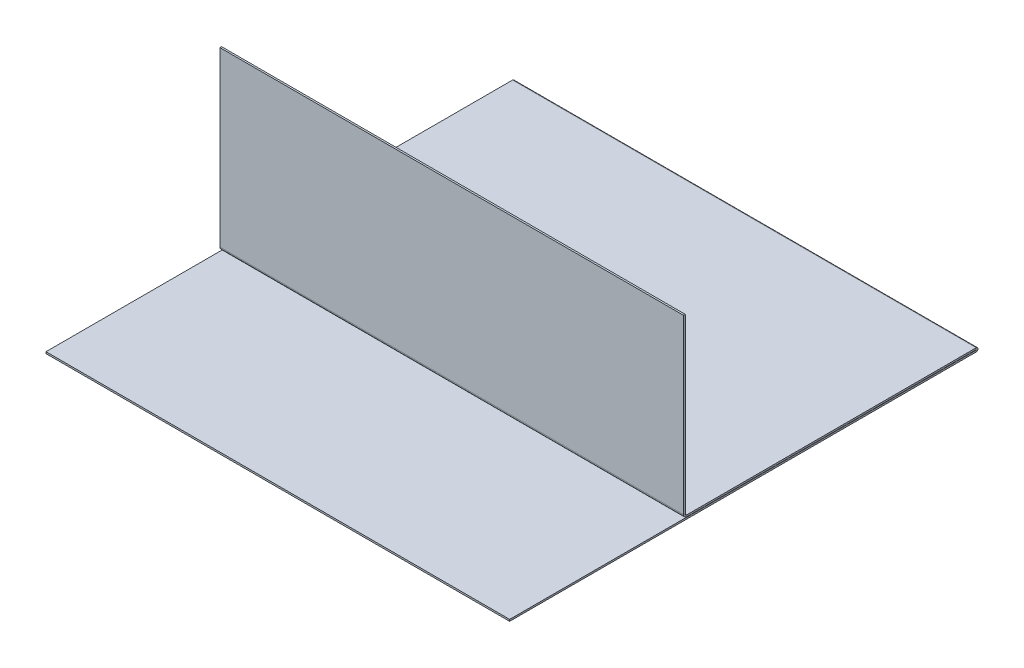
ISO-10303-21;
HEADER;
FILE_DESCRIPTION(('STEP AP214'),'2;1');
FILE_NAME('part.step','',(''),(''),'','','');
FILE_SCHEMA(('AUTOMOTIVE_DESIGN { 1 0 10303 214 1 1 1 1 }'));
ENDSEC;
DATA;
#1=APPLICATION_CONTEXT('core data for automotive mechanical design processes');
#2=APPLICATION_PROTOCOL_DEFINITION('international standard','automotive_design',2000,#1);
#3=PRODUCT_CONTEXT('',#1,'mechanical');
#4=PRODUCT('Part','Part','',(#3));
#5=PRODUCT_RELATED_PRODUCT_CATEGORY('part','',(#4));
#6=PRODUCT_DEFINITION_FORMATION('','',#4);
#7=PRODUCT_DEFINITION_CONTEXT('part definition',#1,'design');
#8=PRODUCT_DEFINITION('design','',#6,#7);
#9=PRODUCT_DEFINITION_SHAPE('','',#8);
#10=(LENGTH_UNIT() NAMED_UNIT(*) SI_UNIT(.MILLI.,.METRE.));
#11=(NAMED_UNIT(*) PLANE_ANGLE_UNIT() SI_UNIT($,.RADIAN.));
#12=(NAMED_UNIT(*) SI_UNIT($,.STERADIAN.) SOLID_ANGLE_UNIT());
#13=UNCERTAINTY_MEASURE_WITH_UNIT(LENGTH_MEASURE(1.E-05),#10,'distance_accuracy_value','');
#14=(GEOMETRIC_REPRESENTATION_CONTEXT(3) GLOBAL_UNCERTAINTY_ASSIGNED_CONTEXT((#13)) GLOBAL_UNIT_ASSIGNED_CONTEXT((#10,
#11,#12)) REPRESENTATION_CONTEXT('',''));
#15=CARTESIAN_POINT('',(0.,0.,0.));
#16=DIRECTION('',(0.,0.,1.));
#17=DIRECTION('',(1.,0.,0.));
#18=AXIS2_PLACEMENT_3D('',#15,#16,#17);
#19=CARTESIAN_POINT('',(99.,-0.7366,-94.9915014164306));
#20=DIRECTION('',(1.,0.,0.));
#21=DIRECTION('',(0.,0.,-1.));
#22=AXIS2_PLACEMENT_3D('',#19,#20,#21);
#23=PLANE('',#22);
#24=DIRECTION('',(0.,0.,-1.));
#25=VECTOR('',#24,1.);
#26=CARTESIAN_POINT('',(99.,-0.7366,-94.9915014164306));
#27=LINE('',#26,#25);
#28=CARTESIAN_POINT('',(99.,-0.736600000000005,29.2718985835694));
#29=VERTEX_POINT('',#28);
#30=CARTESIAN_POINT('',(99.,-0.7366,-94.2049014164306));
#31=VERTEX_POINT('',#30);
#32=EDGE_CURVE('E11',#29,#31,#27,.T.);
#33=ORIENTED_EDGE('',*,*,#32,.T.);
#34=DIRECTION('',(0.,1.,0.));
#35=VECTOR('',#34,1.);
#36=CARTESIAN_POINT('',(99.,-0.7366,-94.2049014164306));
#37=LINE('',#36,#35);
#38=CARTESIAN_POINT('',(99.,0.,-94.2049014164306));
#39=VERTEX_POINT('',#38);
#40=EDGE_CURVE('E140',#31,#39,#37,.T.);
#41=ORIENTED_EDGE('',*,*,#40,.T.);
#42=DIRECTION('',(0.,0.,-1.));
#43=VECTOR('',#42,1.);
#44=CARTESIAN_POINT('',(99.,0.,-94.9915014164306));
#45=LINE('',#44,#43);
#46=CARTESIAN_POINT('',(99.,0.,29.2718985835694));
#47=VERTEX_POINT('',#46);
#48=EDGE_CURVE('E39',#47,#39,#45,.T.);
#49=ORIENTED_EDGE('',*,*,#48,.F.);
#50=DIRECTION('',(0.,-1.,0.));
#51=VECTOR('',#50,1.);
#52=CARTESIAN_POINT('',(99.,0.,29.2718985835694));
#53=LINE('',#52,#51);
#54=EDGE_CURVE('E234',#47,#29,#53,.T.);
#55=ORIENTED_EDGE('',*,*,#54,.T.);
#56=EDGE_LOOP('',(#33,#41,#49,#55));
#57=FACE_BOUND('',#56,.T.);
#58=ADVANCED_FACE('F35',(#57),#23,.T.);
#59=CARTESIAN_POINT('',(0.,-0.7366,0.));
#60=DIRECTION('',(0.,1.,0.));
#61=DIRECTION('',(0.,0.,1.));
#62=AXIS2_PLACEMENT_3D('',#59,#60,#61);
#63=PLANE('',#62);
#64=DIRECTION('',(0.,0.,1.));
#65=VECTOR('',#64,1.);
#66=CARTESIAN_POINT('',(-99.,-0.7366,-94.9915014164306));
#67=LINE('',#66,#65);
#68=CARTESIAN_POINT('',(-99.,-0.7366,-94.2049014164306));
#69=VERTEX_POINT('',#68);
#70=CARTESIAN_POINT('',(-99.,-0.7366,29.2718985835694));
#71=VERTEX_POINT('',#70);
#72=EDGE_CURVE('E44',#69,#71,#67,.T.);
#73=ORIENTED_EDGE('',*,*,#72,.F.);
#74=DIRECTION('',(1.,0.,0.));
#75=VECTOR('',#74,1.);
#76=CARTESIAN_POINT('',(99.,-0.7366,-94.2049014164306));
#77=LINE('',#76,#75);
#78=EDGE_CURVE('E161',#31,#69,#77,.F.);
#79=ORIENTED_EDGE('',*,*,#78,.F.);
#80=ORIENTED_EDGE('',*,*,#32,.F.);
#81=DIRECTION('',(1.,0.,0.));
#82=VECTOR('',#81,1.);
#83=CARTESIAN_POINT('',(99.,-0.736600000000005,29.2718985835694));
#84=LINE('',#83,#82);
#85=EDGE_CURVE('E227',#29,#71,#84,.F.);
#86=ORIENTED_EDGE('',*,*,#85,.T.);
#87=EDGE_LOOP('',(#73,#79,#80,#86));
#88=FACE_BOUND('',#87,.T.);
#89=ADVANCED_FACE('F249',(#88),#63,.F.);
#90=CARTESIAN_POINT('',(0.,0.,0.));
#91=DIRECTION('',(0.,1.,0.));
#92=DIRECTION('',(0.,0.,1.));
#93=AXIS2_PLACEMENT_3D('',#90,#91,#92);
#94=PLANE('',#93);
#95=DIRECTION('',(1.,0.,0.));
#96=VECTOR('',#95,1.);
#97=CARTESIAN_POINT('',(99.,0.,-94.2049014164306));
#98=LINE('',#97,#96);
#99=CARTESIAN_POINT('',(-99.,0.,-94.2049014164306));
#100=VERTEX_POINT('',#99);
#101=EDGE_CURVE('E147',#39,#100,#98,.F.);
#102=ORIENTED_EDGE('',*,*,#101,.T.);
#103=DIRECTION('',(0.,0.,1.));
#104=VECTOR('',#103,1.);
#105=CARTESIAN_POINT('',(-99.,0.,-94.9915014164306));
#106=LINE('',#105,#104);
#107=CARTESIAN_POINT('',(-99.,0.,29.2718985835694));
#108=VERTEX_POINT('',#107);
#109=EDGE_CURVE('E152',#100,#108,#106,.T.);
#110=ORIENTED_EDGE('',*,*,#109,.T.);
#111=DIRECTION('',(1.,0.,0.));
#112=VECTOR('',#111,1.);
#113=CARTESIAN_POINT('',(99.,0.,29.2718985835694));
#114=LINE('',#113,#112);
#115=EDGE_CURVE('E60',#47,#108,#114,.F.);
#116=ORIENTED_EDGE('',*,*,#115,.F.);
#117=ORIENTED_EDGE('',*,*,#48,.T.);
#118=EDGE_LOOP('',(#102,#110,#116,#117));
#119=FACE_BOUND('',#118,.T.);
#120=ADVANCED_FACE('F155',(#119),#94,.T.);
#121=CARTESIAN_POINT('',(-99.,-0.7366,-94.9915014164306));
#122=DIRECTION('',(-1.,0.,0.));
#123=DIRECTION('',(0.,0.,1.));
#124=AXIS2_PLACEMENT_3D('',#121,#122,#123);
#125=PLANE('',#124);
#126=DIRECTION('',(0.,1.,0.));
#127=VECTOR('',#126,1.);
#128=CARTESIAN_POINT('',(-99.,-0.7366,-94.2049014164306));
#129=LINE('',#128,#127);
#130=EDGE_CURVE('E129',#69,#100,#129,.T.);
#131=ORIENTED_EDGE('',*,*,#130,.F.);
#132=ORIENTED_EDGE('',*,*,#72,.T.);
#133=DIRECTION('',(0.,-1.,0.));
#134=VECTOR('',#133,1.);
#135=CARTESIAN_POINT('',(-99.,0.,29.2718985835694));
#136=LINE('',#135,#134);
#137=EDGE_CURVE('E154',#108,#71,#136,.T.);
#138=ORIENTED_EDGE('',*,*,#137,.F.);
#139=ORIENTED_EDGE('',*,*,#109,.F.);
#140=EDGE_LOOP('',(#131,#132,#138,#139));
#141=FACE_BOUND('',#140,.T.);
#142=ADVANCED_FACE('F37',(#141),#125,.T.);
#143=CARTESIAN_POINT('',(-99.,0.736599999999995,29.2718985835694));
#144=DIRECTION('',(-1.,0.,0.));
#145=DIRECTION('',(0.,0.,1.));
#146=AXIS2_PLACEMENT_3D('',#143,#144,#145);
#147=PLANE('',#146);
#148=DIRECTION('',(0.,0.,1.));
#149=VECTOR('',#148,1.);
#150=CARTESIAN_POINT('',(-99.,0.736599999999997,30.0084985835694));
#151=LINE('',#150,#149);
#152=CARTESIAN_POINT('',(-99.,0.736599999999995,30.0084985835694));
#153=VERTEX_POINT('',#152);
#154=CARTESIAN_POINT('',(-99.,0.736599999999995,30.7450985835694));
#155=VERTEX_POINT('',#154);
#156=EDGE_CURVE('E195',#153,#155,#151,.T.);
#157=ORIENTED_EDGE('',*,*,#156,.F.);
#158=CARTESIAN_POINT('',(-99.,0.736599999999995,29.2718985835694));
#159=DIRECTION('',(1.,0.,0.));
#160=DIRECTION('',(0.,0.,-1.));
#161=AXIS2_PLACEMENT_3D('',#158,#159,#160);
#162=CIRCLE('',#161,0.7366);
#163=EDGE_CURVE('E237',#108,#153,#162,.F.);
#164=ORIENTED_EDGE('',*,*,#163,.F.);
#165=ORIENTED_EDGE('',*,*,#137,.T.);
#166=CARTESIAN_POINT('',(-99.,0.736599999999995,29.2718985835694));
#167=DIRECTION('',(1.,0.,0.));
#168=DIRECTION('',(0.,0.,-1.));
#169=AXIS2_PLACEMENT_3D('',#166,#167,#168);
#170=CIRCLE('',#169,1.4732);
#171=EDGE_CURVE('E230',#71,#155,#170,.F.);
#172=ORIENTED_EDGE('',*,*,#171,.T.);
#173=EDGE_LOOP('',(#157,#164,#165,#172));
#174=FACE_BOUND('',#173,.T.);
#175=ADVANCED_FACE('F254',(#174),#147,.T.);
#176=CARTESIAN_POINT('',(99.,0.736599999999995,29.2718985835694));
#177=DIRECTION('',(-1.,0.,0.));
#178=DIRECTION('',(0.,0.,1.));
#179=AXIS2_PLACEMENT_3D('',#176,#177,#178);
#180=PLANE('',#179);
#181=CARTESIAN_POINT('',(99.,0.736599999999995,29.2718985835694));
#182=DIRECTION('',(1.,0.,0.));
#183=DIRECTION('',(0.,0.,-1.));
#184=AXIS2_PLACEMENT_3D('',#181,#182,#183);
#185=CIRCLE('',#184,0.7366);
#186=CARTESIAN_POINT('',(99.,0.736599999999995,30.0084985835694));
#187=VERTEX_POINT('',#186);
#188=EDGE_CURVE('E226',#187,#47,#185,.T.);
#189=ORIENTED_EDGE('',*,*,#188,.F.);
#190=DIRECTION('',(0.,0.,1.));
#191=VECTOR('',#190,1.);
#192=CARTESIAN_POINT('',(99.,0.736599999999993,30.0084985835694));
#193=LINE('',#192,#191);
#194=CARTESIAN_POINT('',(99.,0.736599999999993,30.7450985835694));
#195=VERTEX_POINT('',#194);
#196=EDGE_CURVE('E199',#187,#195,#193,.T.);
#197=ORIENTED_EDGE('',*,*,#196,.T.);
#198=CARTESIAN_POINT('',(99.,0.736599999999995,29.2718985835694));
#199=DIRECTION('',(1.,0.,0.));
#200=DIRECTION('',(0.,0.,-1.));
#201=AXIS2_PLACEMENT_3D('',#198,#199,#200);
#202=CIRCLE('',#201,1.4732);
#203=EDGE_CURVE('E231',#195,#29,#202,.T.);
#204=ORIENTED_EDGE('',*,*,#203,.T.);
#205=ORIENTED_EDGE('',*,*,#54,.F.);
#206=EDGE_LOOP('',(#189,#197,#204,#205));
#207=FACE_BOUND('',#206,.T.);
#208=ADVANCED_FACE('F298',(#207),#180,.F.);
#209=CARTESIAN_POINT('',(99.,0.736599999999995,29.2718985835694));
#210=DIRECTION('',(1.,0.,0.));
#211=DIRECTION('',(0.,0.,1.));
#212=AXIS2_PLACEMENT_3D('',#209,#210,#211);
#213=CYLINDRICAL_SURFACE('',#212,1.4732);
#214=ORIENTED_EDGE('',*,*,#85,.F.);
#215=ORIENTED_EDGE('',*,*,#203,.F.);
#216=DIRECTION('',(-1.,0.,0.));
#217=VECTOR('',#216,1.);
#218=CARTESIAN_POINT('',(0.,0.736599999999995,30.7450985835694));
#219=LINE('',#218,#217);
#220=EDGE_CURVE('E202',#195,#155,#219,.T.);
#221=ORIENTED_EDGE('',*,*,#220,.T.);
#222=ORIENTED_EDGE('',*,*,#171,.F.);
#223=EDGE_LOOP('',(#214,#215,#221,#222));
#224=FACE_BOUND('',#223,.T.);
#225=ADVANCED_FACE('F255',(#224),#213,.T.);
#226=CARTESIAN_POINT('',(99.,0.736599999999995,29.2718985835694));
#227=DIRECTION('',(1.,0.,0.));
#228=DIRECTION('',(0.,0.,1.));
#229=AXIS2_PLACEMENT_3D('',#226,#227,#228);
#230=CYLINDRICAL_SURFACE('',#229,0.7366);
#231=ORIENTED_EDGE('',*,*,#115,.T.);
#232=ORIENTED_EDGE('',*,*,#163,.T.);
#233=DIRECTION('',(1.,0.,0.));
#234=VECTOR('',#233,1.);
#235=CARTESIAN_POINT('',(-99.,0.736599999999997,30.0084985835694));
#236=LINE('',#235,#234);
#237=EDGE_CURVE('E197',#153,#187,#236,.T.);
#238=ORIENTED_EDGE('',*,*,#237,.T.);
#239=ORIENTED_EDGE('',*,*,#188,.T.);
#240=EDGE_LOOP('',(#231,#232,#238,#239));
#241=FACE_BOUND('',#240,.T.);
#242=ADVANCED_FACE('F276',(#241),#230,.F.);
#243=CARTESIAN_POINT('',(-99.,0.,30.7450985835694));
#244=DIRECTION('',(1.,0.,0.));
#245=DIRECTION('',(0.,0.,-1.));
#246=AXIS2_PLACEMENT_3D('',#243,#244,#245);
#247=PLANE('',#246);
#248=ORIENTED_EDGE('',*,*,#156,.T.);
#249=DIRECTION('',(0.,-1.,0.));
#250=VECTOR('',#249,1.);
#251=CARTESIAN_POINT('',(-99.,0.,30.7450985835694));
#252=LINE('',#251,#250);
#253=CARTESIAN_POINT('',(-99.,74.4732,30.7450985835694));
#254=VERTEX_POINT('',#253);
#255=EDGE_CURVE('E207',#254,#155,#252,.T.);
#256=ORIENTED_EDGE('',*,*,#255,.F.);
#257=DIRECTION('',(0.,0.,-1.));
#258=VECTOR('',#257,1.);
#259=CARTESIAN_POINT('',(-99.,74.4732,30.7450985835694));
#260=LINE('',#259,#258);
#261=CARTESIAN_POINT('',(-99.,74.4732,30.0084985835694));
#262=VERTEX_POINT('',#261);
#263=EDGE_CURVE('E215',#254,#262,#260,.T.);
#264=ORIENTED_EDGE('',*,*,#263,.T.);
#265=DIRECTION('',(0.,-1.,0.));
#266=VECTOR('',#265,1.);
#267=CARTESIAN_POINT('',(-99.,0.,30.0084985835694));
#268=LINE('',#267,#266);
#269=EDGE_CURVE('E206',#262,#153,#268,.T.);
#270=ORIENTED_EDGE('',*,*,#269,.T.);
#271=EDGE_LOOP('',(#248,#256,#264,#270));
#272=FACE_BOUND('',#271,.T.);
#273=ADVANCED_FACE('F273',(#272),#247,.F.);
#274=CARTESIAN_POINT('',(99.,74.4732,30.7450985835694));
#275=DIRECTION('',(-1.,0.,0.));
#276=DIRECTION('',(0.,0.,1.));
#277=AXIS2_PLACEMENT_3D('',#274,#275,#276);
#278=PLANE('',#277);
#279=ORIENTED_EDGE('',*,*,#196,.F.);
#280=DIRECTION('',(0.,1.,0.));
#281=VECTOR('',#280,1.);
#282=CARTESIAN_POINT('',(99.,74.4732,30.0084985835694));
#283=LINE('',#282,#281);
#284=CARTESIAN_POINT('',(99.,74.4732,30.0084985835694));
#285=VERTEX_POINT('',#284);
#286=EDGE_CURVE('E218',#187,#285,#283,.T.);
#287=ORIENTED_EDGE('',*,*,#286,.T.);
#288=DIRECTION('',(0.,0.,-1.));
#289=VECTOR('',#288,1.);
#290=CARTESIAN_POINT('',(99.,74.4732,30.7450985835694));
#291=LINE('',#290,#289);
#292=CARTESIAN_POINT('',(99.,74.4732,30.7450985835694));
#293=VERTEX_POINT('',#292);
#294=EDGE_CURVE('E223',#293,#285,#291,.T.);
#295=ORIENTED_EDGE('',*,*,#294,.F.);
#296=DIRECTION('',(0.,1.,0.));
#297=VECTOR('',#296,1.);
#298=CARTESIAN_POINT('',(99.,74.4732,30.7450985835694));
#299=LINE('',#298,#297);
#300=EDGE_CURVE('E210',#195,#293,#299,.T.);
#301=ORIENTED_EDGE('',*,*,#300,.F.);
#302=EDGE_LOOP('',(#279,#287,#295,#301));
#303=FACE_BOUND('',#302,.T.);
#304=ADVANCED_FACE('F264',(#303),#278,.F.);
#305=CARTESIAN_POINT('',(0.,0.,30.7450985835694));
#306=DIRECTION('',(0.,0.,-1.));
#307=DIRECTION('',(-1.,0.,0.));
#308=AXIS2_PLACEMENT_3D('',#305,#306,#307);
#309=PLANE('',#308);
#310=ORIENTED_EDGE('',*,*,#220,.F.);
#311=ORIENTED_EDGE('',*,*,#300,.T.);
#312=DIRECTION('',(-1.,0.,0.));
#313=VECTOR('',#312,1.);
#314=CARTESIAN_POINT('',(-99.,74.4732,30.7450985835694));
#315=LINE('',#314,#313);
#316=EDGE_CURVE('E213',#293,#254,#315,.T.);
#317=ORIENTED_EDGE('',*,*,#316,.T.);
#318=ORIENTED_EDGE('',*,*,#255,.T.);
#319=EDGE_LOOP('',(#310,#311,#317,#318));
#320=FACE_BOUND('',#319,.T.);
#321=ADVANCED_FACE('F259',(#320),#309,.F.);
#322=CARTESIAN_POINT('',(0.,0.,30.0084985835694));
#323=DIRECTION('',(0.,0.,-1.));
#324=DIRECTION('',(-1.,0.,0.));
#325=AXIS2_PLACEMENT_3D('',#322,#323,#324);
#326=PLANE('',#325);
#327=ORIENTED_EDGE('',*,*,#286,.F.);
#328=ORIENTED_EDGE('',*,*,#237,.F.);
#329=ORIENTED_EDGE('',*,*,#269,.F.);
#330=DIRECTION('',(-1.,0.,0.));
#331=VECTOR('',#330,1.);
#332=CARTESIAN_POINT('',(-99.,74.4732,30.0084985835694));
#333=LINE('',#332,#331);
#334=EDGE_CURVE('E211',#285,#262,#333,.T.);
#335=ORIENTED_EDGE('',*,*,#334,.F.);
#336=EDGE_LOOP('',(#327,#328,#329,#335));
#337=FACE_BOUND('',#336,.T.);
#338=ADVANCED_FACE('F279',(#337),#326,.T.);
#339=CARTESIAN_POINT('',(-99.,74.4732,30.7450985835694));
#340=DIRECTION('',(0.,-1.,0.));
#341=DIRECTION('',(0.,0.,-1.));
#342=AXIS2_PLACEMENT_3D('',#339,#340,#341);
#343=PLANE('',#342);
#344=ORIENTED_EDGE('',*,*,#334,.T.);
#345=ORIENTED_EDGE('',*,*,#263,.F.);
#346=ORIENTED_EDGE('',*,*,#316,.F.);
#347=ORIENTED_EDGE('',*,*,#294,.T.);
#348=EDGE_LOOP('',(#344,#345,#346,#347));
#349=FACE_BOUND('',#348,.T.);
#350=ADVANCED_FACE('F270',(#349),#343,.F.);
#351=CARTESIAN_POINT('',(99.,-1.5732,5.40179858356944));
#352=DIRECTION('',(-1.,0.,0.));
#353=DIRECTION('',(0.,0.,-1.));
#354=AXIS2_PLACEMENT_3D('',#351,#352,#353);
#355=PLANE('',#354);
#356=DIRECTION('',(0.,-1.,0.));
#357=VECTOR('',#356,1.);
#358=CARTESIAN_POINT('',(99.,-1.5732,-94.2049014164306));
#359=LINE('',#358,#357);
#360=CARTESIAN_POINT('',(99.,-0.8366,-94.2049014164306));
#361=VERTEX_POINT('',#360);
#362=CARTESIAN_POINT('',(99.,-1.5732,-94.2049014164306));
#363=VERTEX_POINT('',#362);
#364=EDGE_CURVE('E189',#361,#363,#359,.T.);
#365=ORIENTED_EDGE('',*,*,#364,.F.);
#366=DIRECTION('',(0.,0.,-1.));
#367=VECTOR('',#366,1.);
#368=CARTESIAN_POINT('',(99.,-0.8366,5.40179858356944));
#369=LINE('',#368,#367);
#370=CARTESIAN_POINT('',(99.,-0.8366,105.008498583569));
#371=VERTEX_POINT('',#370);
#372=EDGE_CURVE('E180',#371,#361,#369,.T.);
#373=ORIENTED_EDGE('',*,*,#372,.F.);
#374=DIRECTION('',(0.,-1.,0.));
#375=VECTOR('',#374,1.);
#376=CARTESIAN_POINT('',(99.,-1.5732,105.008498583569));
#377=LINE('',#376,#375);
#378=CARTESIAN_POINT('',(99.,-1.5732,105.008498583569));
#379=VERTEX_POINT('',#378);
#380=EDGE_CURVE('E187',#371,#379,#377,.T.);
#381=ORIENTED_EDGE('',*,*,#380,.T.);
#382=DIRECTION('',(0.,0.,-1.));
#383=VECTOR('',#382,1.);
#384=CARTESIAN_POINT('',(99.,-1.5732,5.40179858356944));
#385=LINE('',#384,#383);
#386=EDGE_CURVE('E170',#379,#363,#385,.T.);
#387=ORIENTED_EDGE('',*,*,#386,.T.);
#388=EDGE_LOOP('',(#365,#373,#381,#387));
#389=FACE_BOUND('',#388,.T.);
#390=ADVANCED_FACE('F286',(#389),#355,.F.);
#391=CARTESIAN_POINT('',(0.,-1.5732,105.008498583569));
#392=DIRECTION('',(0.,0.,-1.));
#393=DIRECTION('',(1.,0.,0.));
#394=AXIS2_PLACEMENT_3D('',#391,#392,#393);
#395=PLANE('',#394);
#396=ORIENTED_EDGE('',*,*,#380,.F.);
#397=DIRECTION('',(1.,0.,0.));
#398=VECTOR('',#397,1.);
#399=CARTESIAN_POINT('',(0.,-0.8366,105.008498583569));
#400=LINE('',#399,#398);
#401=CARTESIAN_POINT('',(-99.,-0.8366,105.008498583569));
#402=VERTEX_POINT('',#401);
#403=EDGE_CURVE('E177',#402,#371,#400,.T.);
#404=ORIENTED_EDGE('',*,*,#403,.F.);
#405=DIRECTION('',(0.,-1.,0.));
#406=VECTOR('',#405,1.);
#407=CARTESIAN_POINT('',(-99.,-1.5732,105.008498583569));
#408=LINE('',#407,#406);
#409=CARTESIAN_POINT('',(-99.,-1.5732,105.008498583569));
#410=VERTEX_POINT('',#409);
#411=EDGE_CURVE('E169',#402,#410,#408,.T.);
#412=ORIENTED_EDGE('',*,*,#411,.T.);
#413=DIRECTION('',(1.,0.,0.));
#414=VECTOR('',#413,1.);
#415=CARTESIAN_POINT('',(0.,-1.5732,105.008498583569));
#416=LINE('',#415,#414);
#417=EDGE_CURVE('E166',#410,#379,#416,.T.);
#418=ORIENTED_EDGE('',*,*,#417,.T.);
#419=EDGE_LOOP('',(#396,#404,#412,#418));
#420=FACE_BOUND('',#419,.T.);
#421=ADVANCED_FACE('F367',(#420),#395,.F.);
#422=CARTESIAN_POINT('',(-99.,-1.5732,5.40179858356944));
#423=DIRECTION('',(1.,0.,0.));
#424=DIRECTION('',(0.,0.,1.));
#425=AXIS2_PLACEMENT_3D('',#422,#423,#424);
#426=PLANE('',#425);
#427=DIRECTION('',(0.,0.,-1.));
#428=VECTOR('',#427,1.);
#429=CARTESIAN_POINT('',(-99.,-0.8366,5.40179858356944));
#430=LINE('',#429,#428);
#431=CARTESIAN_POINT('',(-99.,-0.8366,-94.2049014164306));
#432=VERTEX_POINT('',#431);
#433=EDGE_CURVE('E139',#432,#402,#430,.F.);
#434=ORIENTED_EDGE('',*,*,#433,.F.);
#435=DIRECTION('',(0.,-1.,0.));
#436=VECTOR('',#435,1.);
#437=CARTESIAN_POINT('',(-99.,-1.5732,-94.2049014164306));
#438=LINE('',#437,#436);
#439=CARTESIAN_POINT('',(-99.,-1.5732,-94.2049014164306));
#440=VERTEX_POINT('',#439);
#441=EDGE_CURVE('E192',#432,#440,#438,.T.);
#442=ORIENTED_EDGE('',*,*,#441,.T.);
#443=DIRECTION('',(0.,0.,1.));
#444=VECTOR('',#443,1.);
#445=CARTESIAN_POINT('',(-99.,-1.5732,5.40179858356944));
#446=LINE('',#445,#444);
#447=EDGE_CURVE('E174',#440,#410,#446,.T.);
#448=ORIENTED_EDGE('',*,*,#447,.T.);
#449=ORIENTED_EDGE('',*,*,#411,.F.);
#450=EDGE_LOOP('',(#434,#442,#448,#449));
#451=FACE_BOUND('',#450,.T.);
#452=ADVANCED_FACE('F378',(#451),#426,.F.);
#453=CARTESIAN_POINT('',(0.,-1.5732,5.40179858356944));
#454=DIRECTION('',(0.,-1.,0.));
#455=DIRECTION('',(0.,0.,-1.));
#456=AXIS2_PLACEMENT_3D('',#453,#454,#455);
#457=PLANE('',#456);
#458=ORIENTED_EDGE('',*,*,#417,.F.);
#459=ORIENTED_EDGE('',*,*,#447,.F.);
#460=DIRECTION('',(-1.,0.,0.));
#461=VECTOR('',#460,1.);
#462=CARTESIAN_POINT('',(0.,-1.5732,-94.2049014164306));
#463=LINE('',#462,#461);
#464=EDGE_CURVE('E149',#363,#440,#463,.T.);
#465=ORIENTED_EDGE('',*,*,#464,.F.);
#466=ORIENTED_EDGE('',*,*,#386,.F.);
#467=EDGE_LOOP('',(#458,#459,#465,#466));
#468=FACE_BOUND('',#467,.T.);
#469=ADVANCED_FACE('F389',(#468),#457,.T.);
#470=CARTESIAN_POINT('',(0.,-0.8366,5.40179858356944));
#471=DIRECTION('',(0.,-1.,0.));
#472=DIRECTION('',(0.,0.,-1.));
#473=AXIS2_PLACEMENT_3D('',#470,#471,#472);
#474=PLANE('',#473);
#475=ORIENTED_EDGE('',*,*,#403,.T.);
#476=ORIENTED_EDGE('',*,*,#372,.T.);
#477=DIRECTION('',(1.,0.,0.));
#478=VECTOR('',#477,1.);
#479=CARTESIAN_POINT('',(0.,-0.8366,-94.2049014164306));
#480=LINE('',#479,#478);
#481=EDGE_CURVE('E183',#361,#432,#480,.F.);
#482=ORIENTED_EDGE('',*,*,#481,.T.);
#483=ORIENTED_EDGE('',*,*,#433,.T.);
#484=EDGE_LOOP('',(#475,#476,#482,#483));
#485=FACE_BOUND('',#484,.T.);
#486=ADVANCED_FACE('F400',(#485),#474,.F.);
#487=CARTESIAN_POINT('',(-99.,-0.7866,-94.2049014164306));
#488=DIRECTION('',(-1.,0.,0.));
#489=DIRECTION('',(0.,0.,1.));
#490=AXIS2_PLACEMENT_3D('',#487,#488,#489);
#491=PLANE('',#490);
#492=ORIENTED_EDGE('',*,*,#441,.F.);
#493=CARTESIAN_POINT('',(-99.,-0.7866,-94.2049014164306));
#494=DIRECTION('',(1.,0.,0.));
#495=DIRECTION('',(0.,0.,-1.));
#496=AXIS2_PLACEMENT_3D('',#493,#494,#495);
#497=CIRCLE('',#496,0.05);
#498=EDGE_CURVE('E135',#69,#432,#497,.F.);
#499=ORIENTED_EDGE('',*,*,#498,.F.);
#500=ORIENTED_EDGE('',*,*,#130,.T.);
#501=CARTESIAN_POINT('',(-99.,-0.7866,-94.2049014164306));
#502=DIRECTION('',(1.,0.,0.));
#503=DIRECTION('',(0.,0.,-1.));
#504=AXIS2_PLACEMENT_3D('',#501,#502,#503);
#505=CIRCLE('',#504,0.7866);
#506=EDGE_CURVE('E133',#100,#440,#505,.F.);
#507=ORIENTED_EDGE('',*,*,#506,.T.);
#508=EDGE_LOOP('',(#492,#499,#500,#507));
#509=FACE_BOUND('',#508,.T.);
#510=ADVANCED_FACE('F132',(#509),#491,.T.);
#511=CARTESIAN_POINT('',(99.,-0.7866,-94.2049014164306));
#512=DIRECTION('',(-1.,0.,0.));
#513=DIRECTION('',(0.,0.,1.));
#514=AXIS2_PLACEMENT_3D('',#511,#512,#513);
#515=PLANE('',#514);
#516=CARTESIAN_POINT('',(99.,-0.7866,-94.2049014164306));
#517=DIRECTION('',(1.,0.,0.));
#518=DIRECTION('',(0.,0.,-1.));
#519=AXIS2_PLACEMENT_3D('',#516,#517,#518);
#520=CIRCLE('',#519,0.05);
#521=EDGE_CURVE('E52',#361,#31,#520,.T.);
#522=ORIENTED_EDGE('',*,*,#521,.F.);
#523=ORIENTED_EDGE('',*,*,#364,.T.);
#524=CARTESIAN_POINT('',(99.,-0.7866,-94.2049014164306));
#525=DIRECTION('',(1.,0.,0.));
#526=DIRECTION('',(0.,0.,-1.));
#527=AXIS2_PLACEMENT_3D('',#524,#525,#526);
#528=CIRCLE('',#527,0.7866);
#529=EDGE_CURVE('E156',#363,#39,#528,.T.);
#530=ORIENTED_EDGE('',*,*,#529,.T.);
#531=ORIENTED_EDGE('',*,*,#40,.F.);
#532=EDGE_LOOP('',(#522,#523,#530,#531));
#533=FACE_BOUND('',#532,.T.);
#534=ADVANCED_FACE('F421',(#533),#515,.F.);
#535=CARTESIAN_POINT('',(99.,-0.7866,-94.2049014164306));
#536=DIRECTION('',(1.,0.,0.));
#537=DIRECTION('',(0.,-1.,0.));
#538=AXIS2_PLACEMENT_3D('',#535,#536,#537);
#539=CYLINDRICAL_SURFACE('',#538,0.7866);
#540=ORIENTED_EDGE('',*,*,#101,.F.);
#541=ORIENTED_EDGE('',*,*,#529,.F.);
#542=ORIENTED_EDGE('',*,*,#464,.T.);
#543=ORIENTED_EDGE('',*,*,#506,.F.);
#544=EDGE_LOOP('',(#540,#541,#542,#543));
#545=FACE_BOUND('',#544,.T.);
#546=ADVANCED_FACE('F144',(#545),#539,.T.);
#547=CARTESIAN_POINT('',(99.,-0.7866,-94.2049014164306));
#548=DIRECTION('',(1.,0.,0.));
#549=DIRECTION('',(0.,-1.,0.));
#550=AXIS2_PLACEMENT_3D('',#547,#548,#549);
#551=CYLINDRICAL_SURFACE('',#550,0.05);
#552=ORIENTED_EDGE('',*,*,#78,.T.);
#553=ORIENTED_EDGE('',*,*,#498,.T.);
#554=ORIENTED_EDGE('',*,*,#481,.F.);
#555=ORIENTED_EDGE('',*,*,#521,.T.);
#556=EDGE_LOOP('',(#552,#553,#554,#555));
#557=FACE_BOUND('',#556,.T.);
#558=ADVANCED_FACE('F441',(#557),#551,.F.);
#559=CLOSED_SHELL('',(#58,#89,#120,#142,#175,#208,#225,#242,#273,#304,#321,#338,#350,#390,#421,
#452,#469,#486,#510,#534,#546,#558));
#560=MANIFOLD_SOLID_BREP('B2',#559);
#561=ADVANCED_BREP_SHAPE_REPRESENTATION('',(#18,#560),#14);
#562=SHAPE_DEFINITION_REPRESENTATION(#9,#561);
ENDSEC;
END-ISO-10303-21;
